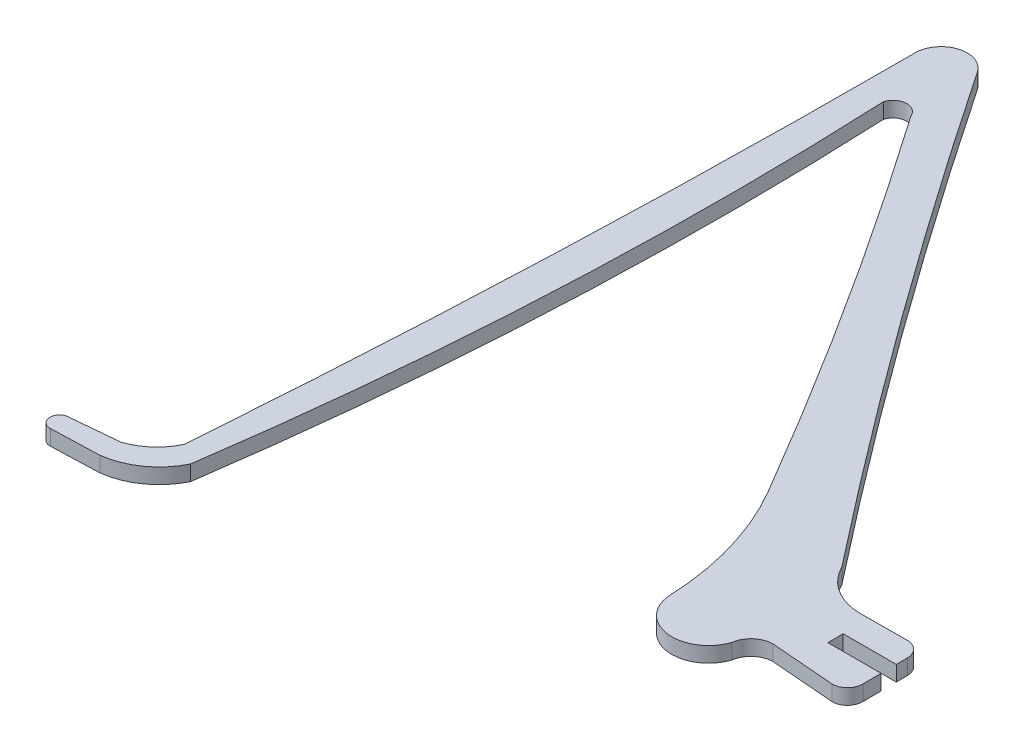
ISO-10303-21;
HEADER;
FILE_DESCRIPTION(('STEP AP214'),'2;1');
FILE_NAME('part.step','',(''),(''),'','','');
FILE_SCHEMA(('AUTOMOTIVE_DESIGN { 1 0 10303 214 1 1 1 1 }'));
ENDSEC;
DATA;
#1=APPLICATION_CONTEXT('core data for automotive mechanical design processes');
#2=APPLICATION_PROTOCOL_DEFINITION('international standard','automotive_design',2000,#1);
#3=PRODUCT_CONTEXT('',#1,'mechanical');
#4=PRODUCT('Part','Part','',(#3));
#5=PRODUCT_RELATED_PRODUCT_CATEGORY('part','',(#4));
#6=PRODUCT_DEFINITION_FORMATION('','',#4);
#7=PRODUCT_DEFINITION_CONTEXT('part definition',#1,'design');
#8=PRODUCT_DEFINITION('design','',#6,#7);
#9=PRODUCT_DEFINITION_SHAPE('','',#8);
#10=(LENGTH_UNIT() NAMED_UNIT(*) SI_UNIT(.MILLI.,.METRE.));
#11=(NAMED_UNIT(*) PLANE_ANGLE_UNIT() SI_UNIT($,.RADIAN.));
#12=(NAMED_UNIT(*) SI_UNIT($,.STERADIAN.) SOLID_ANGLE_UNIT());
#13=UNCERTAINTY_MEASURE_WITH_UNIT(LENGTH_MEASURE(1.E-05),#10,'distance_accuracy_value','');
#14=(GEOMETRIC_REPRESENTATION_CONTEXT(3) GLOBAL_UNCERTAINTY_ASSIGNED_CONTEXT((#13)) GLOBAL_UNIT_ASSIGNED_CONTEXT((#10,
#11,#12)) REPRESENTATION_CONTEXT('',''));
#15=CARTESIAN_POINT('',(0.,0.,0.));
#16=DIRECTION('',(0.,0.,1.));
#17=DIRECTION('',(1.,0.,0.));
#18=AXIS2_PLACEMENT_3D('',#15,#16,#17);
#19=CARTESIAN_POINT('',(-42136.1629241333,3.,-18247.0116923193));
#20=DIRECTION('',(0.,-1.,0.));
#21=DIRECTION('',(0.,0.,-1.));
#22=AXIS2_PLACEMENT_3D('',#19,#20,#21);
#23=CYLINDRICAL_SURFACE('',#22,13.2933695190007);
#24=CARTESIAN_POINT('',(-42136.1629241333,0.,-18247.0116923193));
#25=DIRECTION('',(0.,1.,0.));
#26=DIRECTION('',(0.,0.,1.));
#27=AXIS2_PLACEMENT_3D('',#24,#25,#26);
#28=CIRCLE('',#27,13.2933695190007);
#29=CARTESIAN_POINT('',(-42134.535156,0.,-18233.818359));
#30=VERTEX_POINT('',#29);
#31=CARTESIAN_POINT('',(-42124.20457,0.,-18241.205537));
#32=VERTEX_POINT('',#31);
#33=EDGE_CURVE('E227',#30,#32,#28,.T.);
#34=ORIENTED_EDGE('',*,*,#33,.T.);
#35=DIRECTION('',(0.,-1.,0.));
#36=VECTOR('',#35,1.);
#37=CARTESIAN_POINT('',(-42124.20457,3.,-18241.205537));
#38=LINE('',#37,#36);
#39=CARTESIAN_POINT('',(-42124.20457,3.,-18241.205537));
#40=VERTEX_POINT('',#39);
#41=EDGE_CURVE('E11',#40,#32,#38,.T.);
#42=ORIENTED_EDGE('',*,*,#41,.F.);
#43=CARTESIAN_POINT('',(-42136.1629241333,3.,-18247.0116923193));
#44=DIRECTION('',(0.,1.,0.));
#45=DIRECTION('',(0.,0.,1.));
#46=AXIS2_PLACEMENT_3D('',#43,#44,#45);
#47=CIRCLE('',#46,13.2933695190007);
#48=CARTESIAN_POINT('',(-42134.535156,3.,-18233.818359));
#49=VERTEX_POINT('',#48);
#50=EDGE_CURVE('E273',#49,#40,#47,.T.);
#51=ORIENTED_EDGE('',*,*,#50,.F.);
#52=DIRECTION('',(0.,-1.,0.));
#53=VECTOR('',#52,1.);
#54=CARTESIAN_POINT('',(-42134.535156,3.,-18233.818359));
#55=LINE('',#54,#53);
#56=EDGE_CURVE('E223',#49,#30,#55,.T.);
#57=ORIENTED_EDGE('',*,*,#56,.T.);
#58=EDGE_LOOP('',(#34,#42,#51,#57));
#59=FACE_BOUND('',#58,.T.);
#60=ADVANCED_FACE('F35',(#59),#23,.T.);
#61=CARTESIAN_POINT('',(-42799.5026352517,3.,-18339.4436125575));
#62=DIRECTION('',(0.,-1.,0.));
#63=DIRECTION('',(0.,0.,-1.));
#64=AXIS2_PLACEMENT_3D('',#61,#62,#63);
#65=CYLINDRICAL_SURFACE('',#64,682.406181406615);
#66=CARTESIAN_POINT('',(-42799.5026352517,0.,-18339.4436125575));
#67=DIRECTION('',(0.,1.,0.));
#68=DIRECTION('',(0.,0.,1.));
#69=AXIS2_PLACEMENT_3D('',#66,#67,#68);
#70=CIRCLE('',#69,682.406181406615);
#71=CARTESIAN_POINT('',(-42117.800619,0.,-18370.436474));
#72=VERTEX_POINT('',#71);
#73=EDGE_CURVE('E230',#32,#72,#70,.T.);
#74=ORIENTED_EDGE('',*,*,#73,.T.);
#75=DIRECTION('',(0.,-1.,0.));
#76=VECTOR('',#75,1.);
#77=CARTESIAN_POINT('',(-42117.800619,3.,-18370.436474));
#78=LINE('',#77,#76);
#79=CARTESIAN_POINT('',(-42117.800619,3.,-18370.436474));
#80=VERTEX_POINT('',#79);
#81=EDGE_CURVE('E43',#80,#72,#78,.T.);
#82=ORIENTED_EDGE('',*,*,#81,.F.);
#83=CARTESIAN_POINT('',(-42799.5026352517,3.,-18339.4436125575));
#84=DIRECTION('',(0.,1.,0.));
#85=DIRECTION('',(0.,0.,1.));
#86=AXIS2_PLACEMENT_3D('',#83,#84,#85);
#87=CIRCLE('',#86,682.406181406615);
#88=EDGE_CURVE('E142',#40,#80,#87,.T.);
#89=ORIENTED_EDGE('',*,*,#88,.F.);
#90=ORIENTED_EDGE('',*,*,#41,.T.);
#91=EDGE_LOOP('',(#74,#82,#89,#90));
#92=FACE_BOUND('',#91,.T.);
#93=ADVANCED_FACE('F411',(#92),#65,.T.);
#94=CARTESIAN_POINT('',(-42115.2010584429,3.,-18369.7403817941));
#95=DIRECTION('',(0.,-1.,0.));
#96=DIRECTION('',(0.,0.,-1.));
#97=AXIS2_PLACEMENT_3D('',#94,#95,#96);
#98=CYLINDRICAL_SURFACE('',#97,2.69114463549418);
#99=CARTESIAN_POINT('',(-42115.2010584429,0.,-18369.7403817941));
#100=DIRECTION('',(0.,-1.,0.));
#101=DIRECTION('',(0.,0.,1.));
#102=AXIS2_PLACEMENT_3D('',#99,#100,#101);
#103=CIRCLE('',#102,2.69114463549418);
#104=CARTESIAN_POINT('',(-42112.7270129999,0.,-18370.7993239998));
#105=VERTEX_POINT('',#104);
#106=EDGE_CURVE('E232',#72,#105,#103,.T.);
#107=ORIENTED_EDGE('',*,*,#106,.T.);
#108=DIRECTION('',(0.,-1.,0.));
#109=VECTOR('',#108,1.);
#110=CARTESIAN_POINT('',(-42112.7270129999,3.,-18370.7993239998));
#111=LINE('',#110,#109);
#112=CARTESIAN_POINT('',(-42112.7270129999,3.,-18370.7993239998));
#113=VERTEX_POINT('',#112);
#114=EDGE_CURVE('E328',#113,#105,#111,.T.);
#115=ORIENTED_EDGE('',*,*,#114,.F.);
#116=CARTESIAN_POINT('',(-42115.2010584429,3.,-18369.7403817941));
#117=DIRECTION('',(0.,-1.,0.));
#118=DIRECTION('',(0.,0.,1.));
#119=AXIS2_PLACEMENT_3D('',#116,#117,#118);
#120=CIRCLE('',#119,2.69114463549418);
#121=EDGE_CURVE('E336',#80,#113,#120,.T.);
#122=ORIENTED_EDGE('',*,*,#121,.F.);
#123=ORIENTED_EDGE('',*,*,#81,.T.);
#124=EDGE_LOOP('',(#107,#115,#122,#123));
#125=FACE_BOUND('',#124,.T.);
#126=ADVANCED_FACE('F334',(#125),#98,.F.);
#127=CARTESIAN_POINT('',(-43045.39922722,3.,-17718.987308998));
#128=DIRECTION('',(0.,-1.,0.));
#129=DIRECTION('',(0.,0.,-1.));
#130=AXIS2_PLACEMENT_3D('',#127,#128,#129);
#131=CYLINDRICAL_SURFACE('',#130,1137.8648259257);
#132=CARTESIAN_POINT('',(-43045.39922722,0.,-17718.987308998));
#133=DIRECTION('',(0.,-1.,0.));
#134=DIRECTION('',(0.,0.,1.));
#135=AXIS2_PLACEMENT_3D('',#132,#133,#134);
#136=CIRCLE('',#135,1137.8648259257);
#137=CARTESIAN_POINT('',(-42062.969694,0.,-18293.0679429999));
#138=VERTEX_POINT('',#137);
#139=EDGE_CURVE('E234',#105,#138,#136,.T.);
#140=ORIENTED_EDGE('',*,*,#139,.T.);
#141=DIRECTION('',(0.,-1.,0.));
#142=VECTOR('',#141,1.);
#143=CARTESIAN_POINT('',(-42062.969694,3.,-18293.0679429999));
#144=LINE('',#143,#142);
#145=CARTESIAN_POINT('',(-42062.969694,3.,-18293.0679429999));
#146=VERTEX_POINT('',#145);
#147=EDGE_CURVE('E325',#146,#138,#144,.T.);
#148=ORIENTED_EDGE('',*,*,#147,.F.);
#149=CARTESIAN_POINT('',(-43045.39922722,3.,-17718.987308998));
#150=DIRECTION('',(0.,-1.,0.));
#151=DIRECTION('',(0.,0.,1.));
#152=AXIS2_PLACEMENT_3D('',#149,#150,#151);
#153=CIRCLE('',#152,1137.8648259257);
#154=EDGE_CURVE('E354',#113,#146,#153,.T.);
#155=ORIENTED_EDGE('',*,*,#154,.F.);
#156=ORIENTED_EDGE('',*,*,#114,.T.);
#157=EDGE_LOOP('',(#140,#148,#155,#156));
#158=FACE_BOUND('',#157,.T.);
#159=ADVANCED_FACE('F345',(#158),#131,.F.);
#160=CARTESIAN_POINT('',(-42113.6161511297,3.,-18263.4671733833));
#161=DIRECTION('',(0.,-1.,0.));
#162=DIRECTION('',(0.,0.,-1.));
#163=AXIS2_PLACEMENT_3D('',#160,#161,#162);
#164=CYLINDRICAL_SURFACE('',#163,58.6623318806952);
#165=CARTESIAN_POINT('',(-42113.6161511297,0.,-18263.4671733833));
#166=DIRECTION('',(0.,-1.,0.));
#167=DIRECTION('',(0.,0.,1.));
#168=AXIS2_PLACEMENT_3D('',#165,#166,#167);
#169=CIRCLE('',#168,58.6623318806952);
#170=CARTESIAN_POINT('',(-42055.005587,0.,-18265.931104));
#171=VERTEX_POINT('',#170);
#172=EDGE_CURVE('E236',#138,#171,#169,.T.);
#173=ORIENTED_EDGE('',*,*,#172,.T.);
#174=DIRECTION('',(0.,-1.,0.));
#175=VECTOR('',#174,1.);
#176=CARTESIAN_POINT('',(-42055.005587,3.,-18265.931104));
#177=LINE('',#176,#175);
#178=CARTESIAN_POINT('',(-42055.005587,3.,-18265.931104));
#179=VERTEX_POINT('',#178);
#180=EDGE_CURVE('E322',#179,#171,#177,.T.);
#181=ORIENTED_EDGE('',*,*,#180,.F.);
#182=CARTESIAN_POINT('',(-42113.6161511297,3.,-18263.4671733833));
#183=DIRECTION('',(0.,-1.,0.));
#184=DIRECTION('',(0.,0.,1.));
#185=AXIS2_PLACEMENT_3D('',#182,#183,#184);
#186=CIRCLE('',#185,58.6623318806952);
#187=EDGE_CURVE('E351',#146,#179,#186,.T.);
#188=ORIENTED_EDGE('',*,*,#187,.F.);
#189=ORIENTED_EDGE('',*,*,#147,.T.);
#190=EDGE_LOOP('',(#173,#181,#188,#189));
#191=FACE_BOUND('',#190,.T.);
#192=ADVANCED_FACE('F349',(#191),#164,.F.);
#193=CARTESIAN_POINT('',(-42047.7937259743,3.,-18266.2344820008));
#194=DIRECTION('',(0.,-1.,0.));
#195=DIRECTION('',(0.,0.,-1.));
#196=AXIS2_PLACEMENT_3D('',#193,#194,#195);
#197=CYLINDRICAL_SURFACE('',#196,7.21823923581322);
#198=CARTESIAN_POINT('',(-42047.7937259743,0.,-18266.2344820008));
#199=DIRECTION('',(0.,1.,0.));
#200=DIRECTION('',(0.,0.,1.));
#201=AXIS2_PLACEMENT_3D('',#198,#199,#200);
#202=CIRCLE('',#201,7.21823923581322);
#203=CARTESIAN_POINT('',(-42040.948503,0.,-18263.944089));
#204=VERTEX_POINT('',#203);
#205=EDGE_CURVE('E238',#171,#204,#202,.T.);
#206=ORIENTED_EDGE('',*,*,#205,.T.);
#207=DIRECTION('',(0.,-1.,0.));
#208=VECTOR('',#207,1.);
#209=CARTESIAN_POINT('',(-42040.948503,3.,-18263.944089));
#210=LINE('',#209,#208);
#211=CARTESIAN_POINT('',(-42040.948503,3.,-18263.944089));
#212=VERTEX_POINT('',#211);
#213=EDGE_CURVE('E319',#212,#204,#210,.T.);
#214=ORIENTED_EDGE('',*,*,#213,.F.);
#215=CARTESIAN_POINT('',(-42047.7937259743,3.,-18266.2344820008));
#216=DIRECTION('',(0.,1.,0.));
#217=DIRECTION('',(0.,0.,1.));
#218=AXIS2_PLACEMENT_3D('',#215,#216,#217);
#219=CIRCLE('',#218,7.21823923581322);
#220=EDGE_CURVE('E353',#179,#212,#219,.T.);
#221=ORIENTED_EDGE('',*,*,#220,.F.);
#222=ORIENTED_EDGE('',*,*,#180,.T.);
#223=EDGE_LOOP('',(#206,#214,#221,#222));
#224=FACE_BOUND('',#223,.T.);
#225=ADVANCED_FACE('F424',(#224),#197,.T.);
#226=CARTESIAN_POINT('',(-42036.6327541432,3.,-18263.357472388));
#227=DIRECTION('',(0.,-1.,0.));
#228=DIRECTION('',(0.,0.,-1.));
#229=AXIS2_PLACEMENT_3D('',#226,#227,#228);
#230=CYLINDRICAL_SURFACE('',#229,4.35543421999841);
#231=CARTESIAN_POINT('',(-42036.6327541432,0.,-18263.357472388));
#232=DIRECTION('',(0.,-1.,0.));
#233=DIRECTION('',(0.,0.,1.));
#234=AXIS2_PLACEMENT_3D('',#231,#232,#233);
#235=CIRCLE('',#234,4.35543421999841);
#236=CARTESIAN_POINT('',(-42036.621094,0.,-18267.712891));
#237=VERTEX_POINT('',#236);
#238=EDGE_CURVE('E240',#204,#237,#235,.T.);
#239=ORIENTED_EDGE('',*,*,#238,.T.);
#240=DIRECTION('',(0.,-1.,0.));
#241=VECTOR('',#240,1.);
#242=CARTESIAN_POINT('',(-42036.621094,3.,-18267.712891));
#243=LINE('',#242,#241);
#244=CARTESIAN_POINT('',(-42036.621094,3.,-18267.712891));
#245=VERTEX_POINT('',#244);
#246=EDGE_CURVE('E316',#245,#237,#243,.T.);
#247=ORIENTED_EDGE('',*,*,#246,.F.);
#248=CARTESIAN_POINT('',(-42036.6327541432,3.,-18263.357472388));
#249=DIRECTION('',(0.,-1.,0.));
#250=DIRECTION('',(0.,0.,1.));
#251=AXIS2_PLACEMENT_3D('',#248,#249,#250);
#252=CIRCLE('',#251,4.35543421999841);
#253=EDGE_CURVE('E356',#212,#245,#252,.T.);
#254=ORIENTED_EDGE('',*,*,#253,.F.);
#255=ORIENTED_EDGE('',*,*,#213,.T.);
#256=EDGE_LOOP('',(#239,#247,#254,#255));
#257=FACE_BOUND('',#256,.T.);
#258=ADVANCED_FACE('F427',(#257),#230,.F.);
#259=CARTESIAN_POINT('',(-42024.054306,3.,-18266.695379));
#260=DIRECTION('',(0.0807042317375299,0.,-0.996738093472731));
#261=DIRECTION('',(-0.996738093472731,0.,-0.08070423173753));
#262=AXIS2_PLACEMENT_3D('',#259,#260,#261);
#263=PLANE('',#262);
#264=DIRECTION('',(0.996738093472731,0.,0.0807042317375299));
#265=VECTOR('',#264,1.);
#266=CARTESIAN_POINT('',(-42024.054306,0.,-18266.695379));
#267=LINE('',#266,#265);
#268=CARTESIAN_POINT('',(-42024.054306,0.,-18266.695379));
#269=VERTEX_POINT('',#268);
#270=EDGE_CURVE('E242',#237,#269,#267,.T.);
#271=ORIENTED_EDGE('',*,*,#270,.T.);
#272=DIRECTION('',(0.,-1.,0.));
#273=VECTOR('',#272,1.);
#274=CARTESIAN_POINT('',(-42024.054306,3.,-18266.695379));
#275=LINE('',#274,#273);
#276=CARTESIAN_POINT('',(-42024.054306,3.,-18266.695379));
#277=VERTEX_POINT('',#276);
#278=EDGE_CURVE('E313',#277,#269,#275,.T.);
#279=ORIENTED_EDGE('',*,*,#278,.F.);
#280=DIRECTION('',(0.996738093472731,0.,0.0807042317375299));
#281=VECTOR('',#280,1.);
#282=CARTESIAN_POINT('',(-42024.054306,3.,-18266.695379));
#283=LINE('',#282,#281);
#284=EDGE_CURVE('E362',#245,#277,#283,.T.);
#285=ORIENTED_EDGE('',*,*,#284,.F.);
#286=ORIENTED_EDGE('',*,*,#246,.T.);
#287=EDGE_LOOP('',(#271,#279,#285,#286));
#288=FACE_BOUND('',#287,.T.);
#289=ADVANCED_FACE('F431',(#288),#263,.F.);
#290=CARTESIAN_POINT('',(-42024.0761180298,3.,-18269.6933841043));
#291=DIRECTION('',(0.,-1.,0.));
#292=DIRECTION('',(0.,0.,-1.));
#293=AXIS2_PLACEMENT_3D('',#290,#291,#292);
#294=CYLINDRICAL_SURFACE('',#293,2.99808445010241);
#295=CARTESIAN_POINT('',(-42024.0761180298,0.,-18269.6933841043));
#296=DIRECTION('',(0.,1.,0.));
#297=DIRECTION('',(0.,0.,1.));
#298=AXIS2_PLACEMENT_3D('',#295,#296,#297);
#299=CIRCLE('',#298,2.99808445010241);
#300=CARTESIAN_POINT('',(-42021.0781250001,0.,-18269.716797));
#301=VERTEX_POINT('',#300);
#302=EDGE_CURVE('E244',#269,#301,#299,.T.);
#303=ORIENTED_EDGE('',*,*,#302,.T.);
#304=DIRECTION('',(0.,-1.,0.));
#305=VECTOR('',#304,1.);
#306=CARTESIAN_POINT('',(-42021.0781250001,3.,-18269.716797));
#307=LINE('',#306,#305);
#308=CARTESIAN_POINT('',(-42021.0781250001,3.,-18269.716797));
#309=VERTEX_POINT('',#308);
#310=EDGE_CURVE('E310',#309,#301,#307,.T.);
#311=ORIENTED_EDGE('',*,*,#310,.F.);
#312=CARTESIAN_POINT('',(-42024.0761180298,3.,-18269.6933841043));
#313=DIRECTION('',(0.,1.,0.));
#314=DIRECTION('',(0.,0.,1.));
#315=AXIS2_PLACEMENT_3D('',#312,#313,#314);
#316=CIRCLE('',#315,2.99808445010241);
#317=EDGE_CURVE('E364',#277,#309,#316,.T.);
#318=ORIENTED_EDGE('',*,*,#317,.F.);
#319=ORIENTED_EDGE('',*,*,#278,.T.);
#320=EDGE_LOOP('',(#303,#311,#318,#319));
#321=FACE_BOUND('',#320,.T.);
#322=ADVANCED_FACE('F435',(#321),#294,.T.);
#323=CARTESIAN_POINT('',(-42021.101562,3.,-18273.310547));
#324=DIRECTION('',(-0.999978735045173,0.,0.00652146129754459));
#325=DIRECTION('',(0.0065214612975446,0.,0.999978735045173));
#326=AXIS2_PLACEMENT_3D('',#323,#324,#325);
#327=PLANE('',#326);
#328=DIRECTION('',(-0.0065214612975446,0.,-0.999978735045173));
#329=VECTOR('',#328,1.);
#330=CARTESIAN_POINT('',(-42021.101562,0.,-18273.310547));
#331=LINE('',#330,#329);
#332=CARTESIAN_POINT('',(-42021.101562,0.,-18273.310547));
#333=VERTEX_POINT('',#332);
#334=EDGE_CURVE('E246',#301,#333,#331,.T.);
#335=ORIENTED_EDGE('',*,*,#334,.T.);
#336=DIRECTION('',(0.,-1.,0.));
#337=VECTOR('',#336,1.);
#338=CARTESIAN_POINT('',(-42021.101562,3.,-18273.310547));
#339=LINE('',#338,#337);
#340=CARTESIAN_POINT('',(-42021.101562,3.,-18273.310547));
#341=VERTEX_POINT('',#340);
#342=EDGE_CURVE('E307',#341,#333,#339,.T.);
#343=ORIENTED_EDGE('',*,*,#342,.F.);
#344=DIRECTION('',(-0.0065214612975446,0.,-0.999978735045173));
#345=VECTOR('',#344,1.);
#346=CARTESIAN_POINT('',(-42021.101562,3.,-18273.310547));
#347=LINE('',#346,#345);
#348=EDGE_CURVE('E366',#309,#341,#347,.T.);
#349=ORIENTED_EDGE('',*,*,#348,.F.);
#350=ORIENTED_EDGE('',*,*,#310,.T.);
#351=EDGE_LOOP('',(#335,#343,#349,#350));
#352=FACE_BOUND('',#351,.T.);
#353=ADVANCED_FACE('F439',(#352),#327,.F.);
#354=CARTESIAN_POINT('',(-42031.503906,3.,-18273.308594));
#355=DIRECTION('',(0.000187746143302033,0.,0.999999982375693));
#356=DIRECTION('',(0.999999982375693,0.,-0.000187746143302033));
#357=AXIS2_PLACEMENT_3D('',#354,#355,#356);
#358=PLANE('',#357);
#359=DIRECTION('',(-0.999999982375693,0.,0.000187746143302033));
#360=VECTOR('',#359,1.);
#361=CARTESIAN_POINT('',(-42031.503906,0.,-18273.308594));
#362=LINE('',#361,#360);
#363=CARTESIAN_POINT('',(-42031.503906,0.,-18273.308594));
#364=VERTEX_POINT('',#363);
#365=EDGE_CURVE('E248',#333,#364,#362,.T.);
#366=ORIENTED_EDGE('',*,*,#365,.T.);
#367=DIRECTION('',(0.,-1.,0.));
#368=VECTOR('',#367,1.);
#369=CARTESIAN_POINT('',(-42031.503906,3.,-18273.308594));
#370=LINE('',#369,#368);
#371=CARTESIAN_POINT('',(-42031.503906,3.,-18273.308594));
#372=VERTEX_POINT('',#371);
#373=EDGE_CURVE('E304',#372,#364,#370,.T.);
#374=ORIENTED_EDGE('',*,*,#373,.F.);
#375=DIRECTION('',(-0.999999982375693,0.,0.000187746143302033));
#376=VECTOR('',#375,1.);
#377=CARTESIAN_POINT('',(-42031.503906,3.,-18273.308594));
#378=LINE('',#377,#376);
#379=EDGE_CURVE('E368',#341,#372,#378,.T.);
#380=ORIENTED_EDGE('',*,*,#379,.F.);
#381=ORIENTED_EDGE('',*,*,#342,.T.);
#382=EDGE_LOOP('',(#366,#374,#380,#381));
#383=FACE_BOUND('',#382,.T.);
#384=ADVANCED_FACE('F443',(#383),#358,.F.);
#385=CARTESIAN_POINT('',(-42031.527344,3.,-18276.308594));
#386=DIRECTION('',(-0.999969482516793,0.,0.00781242824594002));
#387=DIRECTION('',(0.00781242824594003,0.,0.999969482516793));
#388=AXIS2_PLACEMENT_3D('',#385,#386,#387);
#389=PLANE('',#388);
#390=DIRECTION('',(-0.00781242824594002,0.,-0.999969482516792));
#391=VECTOR('',#390,1.);
#392=CARTESIAN_POINT('',(-42031.527344,0.,-18276.308594));
#393=LINE('',#392,#391);
#394=CARTESIAN_POINT('',(-42031.527344,0.,-18276.308594));
#395=VERTEX_POINT('',#394);
#396=EDGE_CURVE('E250',#364,#395,#393,.T.);
#397=ORIENTED_EDGE('',*,*,#396,.T.);
#398=DIRECTION('',(0.,-1.,0.));
#399=VECTOR('',#398,1.);
#400=CARTESIAN_POINT('',(-42031.527344,3.,-18276.308594));
#401=LINE('',#400,#399);
#402=CARTESIAN_POINT('',(-42031.527344,3.,-18276.308594));
#403=VERTEX_POINT('',#402);
#404=EDGE_CURVE('E301',#403,#395,#401,.T.);
#405=ORIENTED_EDGE('',*,*,#404,.F.);
#406=DIRECTION('',(-0.00781242824594002,0.,-0.999969482516792));
#407=VECTOR('',#406,1.);
#408=CARTESIAN_POINT('',(-42031.527344,3.,-18276.308594));
#409=LINE('',#408,#407);
#410=EDGE_CURVE('E370',#372,#403,#409,.T.);
#411=ORIENTED_EDGE('',*,*,#410,.F.);
#412=ORIENTED_EDGE('',*,*,#373,.T.);
#413=EDGE_LOOP('',(#397,#405,#411,#412));
#414=FACE_BOUND('',#413,.T.);
#415=ADVANCED_FACE('F447',(#414),#389,.F.);
#416=CARTESIAN_POINT('',(-42021.117187,3.,-18276.308594));
#417=DIRECTION('',(0.,0.,-1.));
#418=DIRECTION('',(-1.,0.,0.));
#419=AXIS2_PLACEMENT_3D('',#416,#417,#418);
#420=PLANE('',#419);
#421=DIRECTION('',(1.,0.,0.));
#422=VECTOR('',#421,1.);
#423=CARTESIAN_POINT('',(-42021.117187,0.,-18276.308594));
#424=LINE('',#423,#422);
#425=CARTESIAN_POINT('',(-42021.117187,0.,-18276.308594));
#426=VERTEX_POINT('',#425);
#427=EDGE_CURVE('E252',#395,#426,#424,.T.);
#428=ORIENTED_EDGE('',*,*,#427,.T.);
#429=DIRECTION('',(0.,-1.,0.));
#430=VECTOR('',#429,1.);
#431=CARTESIAN_POINT('',(-42021.117187,3.,-18276.308594));
#432=LINE('',#431,#430);
#433=CARTESIAN_POINT('',(-42021.117187,3.,-18276.308594));
#434=VERTEX_POINT('',#433);
#435=EDGE_CURVE('E298',#434,#426,#432,.T.);
#436=ORIENTED_EDGE('',*,*,#435,.F.);
#437=DIRECTION('',(1.,0.,0.));
#438=VECTOR('',#437,1.);
#439=CARTESIAN_POINT('',(-42021.117187,3.,-18276.308594));
#440=LINE('',#439,#438);
#441=EDGE_CURVE('E372',#403,#434,#440,.T.);
#442=ORIENTED_EDGE('',*,*,#441,.F.);
#443=ORIENTED_EDGE('',*,*,#404,.T.);
#444=EDGE_LOOP('',(#428,#436,#442,#443));
#445=FACE_BOUND('',#444,.T.);
#446=ADVANCED_FACE('F451',(#445),#420,.F.);
#447=CARTESIAN_POINT('',(-42021.132872,3.,-18278.491515));
#448=DIRECTION('',(-0.999974186541505,0.,0.0071851409627669));
#449=DIRECTION('',(0.0071851409627669,0.,0.999974186541505));
#450=AXIS2_PLACEMENT_3D('',#447,#448,#449);
#451=PLANE('',#450);
#452=DIRECTION('',(-0.0071851409627669,0.,-0.999974186541505));
#453=VECTOR('',#452,1.);
#454=CARTESIAN_POINT('',(-42021.132872,0.,-18278.491515));
#455=LINE('',#454,#453);
#456=CARTESIAN_POINT('',(-42021.132872,0.,-18278.491515));
#457=VERTEX_POINT('',#456);
#458=EDGE_CURVE('E254',#426,#457,#455,.T.);
#459=ORIENTED_EDGE('',*,*,#458,.T.);
#460=DIRECTION('',(0.,-1.,0.));
#461=VECTOR('',#460,1.);
#462=CARTESIAN_POINT('',(-42021.132872,3.,-18278.491515));
#463=LINE('',#462,#461);
#464=CARTESIAN_POINT('',(-42021.132872,3.,-18278.491515));
#465=VERTEX_POINT('',#464);
#466=EDGE_CURVE('E295',#465,#457,#463,.T.);
#467=ORIENTED_EDGE('',*,*,#466,.F.);
#468=DIRECTION('',(-0.0071851409627669,0.,-0.999974186541505));
#469=VECTOR('',#468,1.);
#470=CARTESIAN_POINT('',(-42021.132872,3.,-18278.491515));
#471=LINE('',#470,#469);
#472=EDGE_CURVE('E374',#434,#465,#471,.T.);
#473=ORIENTED_EDGE('',*,*,#472,.F.);
#474=ORIENTED_EDGE('',*,*,#435,.T.);
#475=EDGE_LOOP('',(#459,#467,#473,#474));
#476=FACE_BOUND('',#475,.T.);
#477=ADVANCED_FACE('F455',(#476),#451,.F.);
#478=CARTESIAN_POINT('',(-42024.1348082438,3.,-18278.4746294841));
#479=DIRECTION('',(0.,-1.,0.));
#480=DIRECTION('',(0.,0.,-1.));
#481=AXIS2_PLACEMENT_3D('',#478,#479,#480);
#482=CYLINDRICAL_SURFACE('',#481,3.00198373291659);
#483=CARTESIAN_POINT('',(-42024.1348082438,0.,-18278.4746294841));
#484=DIRECTION('',(0.,1.,0.));
#485=DIRECTION('',(0.,0.,1.));
#486=AXIS2_PLACEMENT_3D('',#483,#484,#485);
#487=CIRCLE('',#486,3.00198373291659);
#488=CARTESIAN_POINT('',(-42024.152344,0.,-18281.476562));
#489=VERTEX_POINT('',#488);
#490=EDGE_CURVE('E256',#457,#489,#487,.T.);
#491=ORIENTED_EDGE('',*,*,#490,.T.);
#492=DIRECTION('',(0.,-1.,0.));
#493=VECTOR('',#492,1.);
#494=CARTESIAN_POINT('',(-42024.152344,3.,-18281.476562));
#495=LINE('',#494,#493);
#496=CARTESIAN_POINT('',(-42024.152344,3.,-18281.476562));
#497=VERTEX_POINT('',#496);
#498=EDGE_CURVE('E292',#497,#489,#495,.T.);
#499=ORIENTED_EDGE('',*,*,#498,.F.);
#500=CARTESIAN_POINT('',(-42024.1348082438,3.,-18278.4746294841));
#501=DIRECTION('',(0.,1.,0.));
#502=DIRECTION('',(0.,0.,1.));
#503=AXIS2_PLACEMENT_3D('',#500,#501,#502);
#504=CIRCLE('',#503,3.00198373291659);
#505=EDGE_CURVE('E376',#465,#497,#504,.T.);
#506=ORIENTED_EDGE('',*,*,#505,.F.);
#507=ORIENTED_EDGE('',*,*,#466,.T.);
#508=EDGE_LOOP('',(#491,#499,#506,#507));
#509=FACE_BOUND('',#508,.T.);
#510=ADVANCED_FACE('F459',(#509),#482,.T.);
#511=CARTESIAN_POINT('',(-42033.452371,3.,-18281.420521));
#512=DIRECTION('',(0.00602578708217237,0.,0.999981844780214));
#513=DIRECTION('',(0.999981844780214,0.,-0.00602578708217237));
#514=AXIS2_PLACEMENT_3D('',#511,#512,#513);
#515=PLANE('',#514);
#516=DIRECTION('',(-0.999981844780214,0.,0.00602578708217237));
#517=VECTOR('',#516,1.);
#518=CARTESIAN_POINT('',(-42033.452371,0.,-18281.420521));
#519=LINE('',#518,#517);
#520=CARTESIAN_POINT('',(-42033.452371,0.,-18281.420521));
#521=VERTEX_POINT('',#520);
#522=EDGE_CURVE('E258',#489,#521,#519,.T.);
#523=ORIENTED_EDGE('',*,*,#522,.T.);
#524=DIRECTION('',(0.,-1.,0.));
#525=VECTOR('',#524,1.);
#526=CARTESIAN_POINT('',(-42033.452371,3.,-18281.420521));
#527=LINE('',#526,#525);
#528=CARTESIAN_POINT('',(-42033.452371,3.,-18281.420521));
#529=VERTEX_POINT('',#528);
#530=EDGE_CURVE('E289',#529,#521,#527,.T.);
#531=ORIENTED_EDGE('',*,*,#530,.F.);
#532=DIRECTION('',(-0.999981844780214,0.,0.00602578708217237));
#533=VECTOR('',#532,1.);
#534=CARTESIAN_POINT('',(-42033.452371,3.,-18281.420521));
#535=LINE('',#534,#533);
#536=EDGE_CURVE('E378',#497,#529,#535,.T.);
#537=ORIENTED_EDGE('',*,*,#536,.F.);
#538=ORIENTED_EDGE('',*,*,#498,.T.);
#539=EDGE_LOOP('',(#523,#531,#537,#538));
#540=FACE_BOUND('',#539,.T.);
#541=ADVANCED_FACE('F463',(#540),#515,.F.);
#542=CARTESIAN_POINT('',(-42033.2245608101,3.,-18292.2746570495));
#543=DIRECTION('',(0.,-1.,0.));
#544=DIRECTION('',(0.,0.,-1.));
#545=AXIS2_PLACEMENT_3D('',#542,#543,#544);
#546=CYLINDRICAL_SURFACE('',#545,10.856526463997);
#547=CARTESIAN_POINT('',(-42033.2245608101,0.,-18292.2746570495));
#548=DIRECTION('',(0.,-1.,0.));
#549=DIRECTION('',(0.,0.,1.));
#550=AXIS2_PLACEMENT_3D('',#547,#548,#549);
#551=CIRCLE('',#550,10.856526463997);
#552=CARTESIAN_POINT('',(-42042.9887739998,0.,-18287.5286789997));
#553=VERTEX_POINT('',#552);
#554=EDGE_CURVE('E260',#521,#553,#551,.T.);
#555=ORIENTED_EDGE('',*,*,#554,.T.);
#556=DIRECTION('',(0.,-1.,0.));
#557=VECTOR('',#556,1.);
#558=CARTESIAN_POINT('',(-42042.9887739998,3.,-18287.5286789997));
#559=LINE('',#558,#557);
#560=CARTESIAN_POINT('',(-42042.9887739998,3.,-18287.5286789997));
#561=VERTEX_POINT('',#560);
#562=EDGE_CURVE('E286',#561,#553,#559,.T.);
#563=ORIENTED_EDGE('',*,*,#562,.F.);
#564=CARTESIAN_POINT('',(-42033.2245608101,3.,-18292.2746570495));
#565=DIRECTION('',(0.,-1.,0.));
#566=DIRECTION('',(0.,0.,1.));
#567=AXIS2_PLACEMENT_3D('',#564,#565,#566);
#568=CIRCLE('',#567,10.856526463997);
#569=EDGE_CURVE('E380',#529,#561,#568,.T.);
#570=ORIENTED_EDGE('',*,*,#569,.F.);
#571=ORIENTED_EDGE('',*,*,#530,.T.);
#572=EDGE_LOOP('',(#555,#563,#570,#571));
#573=FACE_BOUND('',#572,.T.);
#574=ADVANCED_FACE('F467',(#573),#546,.F.);
#575=CARTESIAN_POINT('',(-40781.9142322962,3.,-19278.6638095235));
#576=DIRECTION('',(0.,-1.,0.));
#577=DIRECTION('',(0.,0.,-1.));
#578=AXIS2_PLACEMENT_3D('',#575,#576,#577);
#579=CYLINDRICAL_SURFACE('',#578,1603.9506995826);
#580=CARTESIAN_POINT('',(-40781.9142322962,0.,-19278.6638095235));
#581=DIRECTION('',(0.,-1.,0.));
#582=DIRECTION('',(0.,0.,1.));
#583=AXIS2_PLACEMENT_3D('',#580,#581,#582);
#584=CIRCLE('',#583,1603.9506995826);
#585=CARTESIAN_POINT('',(-42113.6243129999,0.,-18384.680528));
#586=VERTEX_POINT('',#585);
#587=EDGE_CURVE('E262',#553,#586,#584,.T.);
#588=ORIENTED_EDGE('',*,*,#587,.T.);
#589=DIRECTION('',(0.,-1.,0.));
#590=VECTOR('',#589,1.);
#591=CARTESIAN_POINT('',(-42113.6243129999,3.,-18384.680528));
#592=LINE('',#591,#590);
#593=CARTESIAN_POINT('',(-42113.6243129999,3.,-18384.680528));
#594=VERTEX_POINT('',#593);
#595=EDGE_CURVE('E283',#594,#586,#592,.T.);
#596=ORIENTED_EDGE('',*,*,#595,.F.);
#597=CARTESIAN_POINT('',(-40781.9142322962,3.,-19278.6638095235));
#598=DIRECTION('',(0.,-1.,0.));
#599=DIRECTION('',(0.,0.,1.));
#600=AXIS2_PLACEMENT_3D('',#597,#598,#599);
#601=CIRCLE('',#600,1603.9506995826);
#602=EDGE_CURVE('E382',#561,#594,#601,.T.);
#603=ORIENTED_EDGE('',*,*,#602,.F.);
#604=ORIENTED_EDGE('',*,*,#562,.T.);
#605=EDGE_LOOP('',(#588,#596,#603,#604));
#606=FACE_BOUND('',#605,.T.);
#607=ADVANCED_FACE('F471',(#606),#579,.F.);
#608=CARTESIAN_POINT('',(-42117.8760857451,3.,-18381.8277422377));
#609=DIRECTION('',(0.,-1.,0.));
#610=DIRECTION('',(0.,0.,-1.));
#611=AXIS2_PLACEMENT_3D('',#608,#609,#610);
#612=CYLINDRICAL_SURFACE('',#611,5.12015215416163);
#613=CARTESIAN_POINT('',(-42117.8760857451,0.,-18381.8277422377));
#614=DIRECTION('',(0.,1.,0.));
#615=DIRECTION('',(0.,0.,1.));
#616=AXIS2_PLACEMENT_3D('',#613,#614,#615);
#617=CIRCLE('',#616,5.12015215416163);
#618=CARTESIAN_POINT('',(-42122.976922,0.,-18381.3834140009));
#619=VERTEX_POINT('',#618);
#620=EDGE_CURVE('E264',#586,#619,#617,.T.);
#621=ORIENTED_EDGE('',*,*,#620,.T.);
#622=DIRECTION('',(0.,-1.,0.));
#623=VECTOR('',#622,1.);
#624=CARTESIAN_POINT('',(-42122.976922,3.,-18381.3834140009));
#625=LINE('',#624,#623);
#626=CARTESIAN_POINT('',(-42122.976922,3.,-18381.3834140009));
#627=VERTEX_POINT('',#626);
#628=EDGE_CURVE('E280',#627,#619,#625,.T.);
#629=ORIENTED_EDGE('',*,*,#628,.F.);
#630=CARTESIAN_POINT('',(-42117.8760857451,3.,-18381.8277422377));
#631=DIRECTION('',(0.,1.,0.));
#632=DIRECTION('',(0.,0.,1.));
#633=AXIS2_PLACEMENT_3D('',#630,#631,#632);
#634=CIRCLE('',#633,5.12015215416163);
#635=EDGE_CURVE('E384',#594,#627,#634,.T.);
#636=ORIENTED_EDGE('',*,*,#635,.F.);
#637=ORIENTED_EDGE('',*,*,#595,.T.);
#638=EDGE_LOOP('',(#621,#629,#636,#637));
#639=FACE_BOUND('',#638,.T.);
#640=ADVANCED_FACE('F475',(#639),#612,.T.);
#641=CARTESIAN_POINT('',(-43893.4192093769,3.,-18379.0783183289));
#642=DIRECTION('',(0.,-1.,0.));
#643=DIRECTION('',(0.,0.,-1.));
#644=AXIS2_PLACEMENT_3D('',#641,#642,#643);
#645=CYLINDRICAL_SURFACE('',#644,1770.4437879804);
#646=CARTESIAN_POINT('',(-43893.4192093769,0.,-18379.0783183289));
#647=DIRECTION('',(0.,-1.,0.));
#648=DIRECTION('',(0.,0.,1.));
#649=AXIS2_PLACEMENT_3D('',#646,#647,#648);
#650=CIRCLE('',#649,1770.4437879804);
#651=CARTESIAN_POINT('',(-42128.142478,0.,-18243.9144620001));
#652=VERTEX_POINT('',#651);
#653=EDGE_CURVE('E266',#619,#652,#650,.T.);
#654=ORIENTED_EDGE('',*,*,#653,.T.);
#655=DIRECTION('',(0.,-1.,0.));
#656=VECTOR('',#655,1.);
#657=CARTESIAN_POINT('',(-42128.142478,3.,-18243.9144620001));
#658=LINE('',#657,#656);
#659=CARTESIAN_POINT('',(-42128.142478,3.,-18243.9144620001));
#660=VERTEX_POINT('',#659);
#661=EDGE_CURVE('E277',#660,#652,#658,.T.);
#662=ORIENTED_EDGE('',*,*,#661,.F.);
#663=CARTESIAN_POINT('',(-43893.4192093769,3.,-18379.0783183289));
#664=DIRECTION('',(0.,-1.,0.));
#665=DIRECTION('',(0.,0.,1.));
#666=AXIS2_PLACEMENT_3D('',#663,#664,#665);
#667=CIRCLE('',#666,1770.4437879804);
#668=EDGE_CURVE('E386',#627,#660,#667,.T.);
#669=ORIENTED_EDGE('',*,*,#668,.F.);
#670=ORIENTED_EDGE('',*,*,#628,.T.);
#671=EDGE_LOOP('',(#654,#662,#669,#670));
#672=FACE_BOUND('',#671,.T.);
#673=ADVANCED_FACE('F392',(#672),#645,.F.);
#674=CARTESIAN_POINT('',(-42138.2852787814,3.,-18248.7210245995));
#675=DIRECTION('',(0.,-1.,0.));
#676=DIRECTION('',(0.,0.,-1.));
#677=AXIS2_PLACEMENT_3D('',#674,#675,#676);
#678=CYLINDRICAL_SURFACE('',#677,11.2240568295967);
#679=CARTESIAN_POINT('',(-42138.2852787814,0.,-18248.7210245995));
#680=DIRECTION('',(0.,-1.,0.));
#681=DIRECTION('',(0.,0.,1.));
#682=AXIS2_PLACEMENT_3D('',#679,#680,#681);
#683=CIRCLE('',#682,11.2240568295967);
#684=CARTESIAN_POINT('',(-42134.691406,0.,-18238.087891));
#685=VERTEX_POINT('',#684);
#686=EDGE_CURVE('E268',#652,#685,#683,.T.);
#687=ORIENTED_EDGE('',*,*,#686,.T.);
#688=DIRECTION('',(0.,-1.,0.));
#689=VECTOR('',#688,1.);
#690=CARTESIAN_POINT('',(-42134.691406,3.,-18238.087891));
#691=LINE('',#690,#689);
#692=CARTESIAN_POINT('',(-42134.691406,3.,-18238.087891));
#693=VERTEX_POINT('',#692);
#694=EDGE_CURVE('E218',#693,#685,#691,.T.);
#695=ORIENTED_EDGE('',*,*,#694,.F.);
#696=CARTESIAN_POINT('',(-42138.2852787814,3.,-18248.7210245995));
#697=DIRECTION('',(0.,-1.,0.));
#698=DIRECTION('',(0.,0.,1.));
#699=AXIS2_PLACEMENT_3D('',#696,#697,#698);
#700=CIRCLE('',#699,11.2240568295967);
#701=EDGE_CURVE('E209',#660,#693,#700,.T.);
#702=ORIENTED_EDGE('',*,*,#701,.F.);
#703=ORIENTED_EDGE('',*,*,#661,.T.);
#704=EDGE_LOOP('',(#687,#695,#702,#703));
#705=FACE_BOUND('',#704,.T.);
#706=ADVANCED_FACE('F396',(#705),#678,.F.);
#707=CARTESIAN_POINT('',(-42143.861136,3.,-18237.243574));
#708=DIRECTION('',(0.0916886866851147,0.,0.995787720718607));
#709=DIRECTION('',(0.995787720718607,0.,-0.0916886866851147));
#710=AXIS2_PLACEMENT_3D('',#707,#708,#709);
#711=PLANE('',#710);
#712=DIRECTION('',(-0.995787720718607,0.,0.0916886866851147));
#713=VECTOR('',#712,1.);
#714=CARTESIAN_POINT('',(-42143.861136,0.,-18237.243574));
#715=LINE('',#714,#713);
#716=CARTESIAN_POINT('',(-42143.861136,0.,-18237.243574));
#717=VERTEX_POINT('',#716);
#718=EDGE_CURVE('E217',#685,#717,#715,.T.);
#719=ORIENTED_EDGE('',*,*,#718,.T.);
#720=DIRECTION('',(0.,-1.,0.));
#721=VECTOR('',#720,1.);
#722=CARTESIAN_POINT('',(-42143.861136,3.,-18237.243574));
#723=LINE('',#722,#721);
#724=CARTESIAN_POINT('',(-42143.861136,3.,-18237.243574));
#725=VERTEX_POINT('',#724);
#726=EDGE_CURVE('E214',#725,#717,#723,.T.);
#727=ORIENTED_EDGE('',*,*,#726,.F.);
#728=DIRECTION('',(-0.995787720718607,0.,0.0916886866851147));
#729=VECTOR('',#728,1.);
#730=CARTESIAN_POINT('',(-42143.861136,3.,-18237.243574));
#731=LINE('',#730,#729);
#732=EDGE_CURVE('E203',#693,#725,#731,.T.);
#733=ORIENTED_EDGE('',*,*,#732,.F.);
#734=ORIENTED_EDGE('',*,*,#694,.T.);
#735=EDGE_LOOP('',(#719,#727,#733,#734));
#736=FACE_BOUND('',#735,.T.);
#737=ADVANCED_FACE('F215',(#736),#711,.F.);
#738=CARTESIAN_POINT('',(-42144.0156853855,3.,-18235.3704752379));
#739=DIRECTION('',(0.,-1.,0.));
#740=DIRECTION('',(0.,0.,-1.));
#741=AXIS2_PLACEMENT_3D('',#738,#739,#740);
#742=CYLINDRICAL_SURFACE('',#741,1.8794638823728);
#743=CARTESIAN_POINT('',(-42144.0156853855,0.,-18235.3704752379));
#744=DIRECTION('',(0.,1.,0.));
#745=DIRECTION('',(0.,0.,1.));
#746=AXIS2_PLACEMENT_3D('',#743,#744,#745);
#747=CIRCLE('',#746,1.8794638823728);
#748=CARTESIAN_POINT('',(-42143.949219,0.,-18233.492187));
#749=VERTEX_POINT('',#748);
#750=EDGE_CURVE('E128',#717,#749,#747,.T.);
#751=ORIENTED_EDGE('',*,*,#750,.T.);
#752=DIRECTION('',(0.,-1.,0.));
#753=VECTOR('',#752,1.);
#754=CARTESIAN_POINT('',(-42143.949219,3.,-18233.492187));
#755=LINE('',#754,#753);
#756=CARTESIAN_POINT('',(-42143.949219,3.,-18233.492187));
#757=VERTEX_POINT('',#756);
#758=EDGE_CURVE('E219',#757,#749,#755,.T.);
#759=ORIENTED_EDGE('',*,*,#758,.F.);
#760=CARTESIAN_POINT('',(-42144.0156853855,3.,-18235.3704752379));
#761=DIRECTION('',(0.,1.,0.));
#762=DIRECTION('',(0.,0.,1.));
#763=AXIS2_PLACEMENT_3D('',#760,#761,#762);
#764=CIRCLE('',#763,1.8794638823728);
#765=EDGE_CURVE('E207',#725,#757,#764,.T.);
#766=ORIENTED_EDGE('',*,*,#765,.F.);
#767=ORIENTED_EDGE('',*,*,#726,.T.);
#768=EDGE_LOOP('',(#751,#759,#766,#767));
#769=FACE_BOUND('',#768,.T.);
#770=ADVANCED_FACE('F221',(#769),#742,.T.);
#771=CARTESIAN_POINT('',(-42134.535156,3.,-18233.818359));
#772=DIRECTION('',(-0.0346265370984575,0.,-0.999400321657227));
#773=DIRECTION('',(-0.999400321657227,0.,0.0346265370984575));
#774=AXIS2_PLACEMENT_3D('',#771,#772,#773);
#775=PLANE('',#774);
#776=DIRECTION('',(0.999400321657227,0.,-0.0346265370984575));
#777=VECTOR('',#776,1.);
#778=CARTESIAN_POINT('',(-42134.535156,0.,-18233.818359));
#779=LINE('',#778,#777);
#780=EDGE_CURVE('E134',#749,#30,#779,.T.);
#781=ORIENTED_EDGE('',*,*,#780,.T.);
#782=ORIENTED_EDGE('',*,*,#56,.F.);
#783=DIRECTION('',(0.999400321657227,0.,-0.0346265370984575));
#784=VECTOR('',#783,1.);
#785=CARTESIAN_POINT('',(-42134.535156,3.,-18233.818359));
#786=LINE('',#785,#784);
#787=EDGE_CURVE('E51',#757,#49,#786,.T.);
#788=ORIENTED_EDGE('',*,*,#787,.F.);
#789=ORIENTED_EDGE('',*,*,#758,.T.);
#790=EDGE_LOOP('',(#781,#782,#788,#789));
#791=FACE_BOUND('',#790,.T.);
#792=ADVANCED_FACE('F400',(#791),#775,.F.);
#793=CARTESIAN_POINT('',(-42136.1629241333,3.,-18247.0116923193));
#794=DIRECTION('',(0.,1.,0.));
#795=DIRECTION('',(0.,0.,1.));
#796=AXIS2_PLACEMENT_3D('',#793,#794,#795);
#797=PLANE('',#796);
#798=ORIENTED_EDGE('',*,*,#50,.T.);
#799=ORIENTED_EDGE('',*,*,#88,.T.);
#800=ORIENTED_EDGE('',*,*,#121,.T.);
#801=ORIENTED_EDGE('',*,*,#154,.T.);
#802=ORIENTED_EDGE('',*,*,#187,.T.);
#803=ORIENTED_EDGE('',*,*,#220,.T.);
#804=ORIENTED_EDGE('',*,*,#253,.T.);
#805=ORIENTED_EDGE('',*,*,#284,.T.);
#806=ORIENTED_EDGE('',*,*,#317,.T.);
#807=ORIENTED_EDGE('',*,*,#348,.T.);
#808=ORIENTED_EDGE('',*,*,#379,.T.);
#809=ORIENTED_EDGE('',*,*,#410,.T.);
#810=ORIENTED_EDGE('',*,*,#441,.T.);
#811=ORIENTED_EDGE('',*,*,#472,.T.);
#812=ORIENTED_EDGE('',*,*,#505,.T.);
#813=ORIENTED_EDGE('',*,*,#536,.T.);
#814=ORIENTED_EDGE('',*,*,#569,.T.);
#815=ORIENTED_EDGE('',*,*,#602,.T.);
#816=ORIENTED_EDGE('',*,*,#635,.T.);
#817=ORIENTED_EDGE('',*,*,#668,.T.);
#818=ORIENTED_EDGE('',*,*,#701,.T.);
#819=ORIENTED_EDGE('',*,*,#732,.T.);
#820=ORIENTED_EDGE('',*,*,#765,.T.);
#821=ORIENTED_EDGE('',*,*,#787,.T.);
#822=EDGE_LOOP('',(#798,#799,#800,#801,#802,#803,#804,#805,#806,#807,#808,#809,#810,#811,#812,
#813,#814,#815,#816,#817,#818,#819,#820,#821));
#823=FACE_BOUND('',#822,.T.);
#824=ADVANCED_FACE('F205',(#823),#797,.T.);
#825=CARTESIAN_POINT('',(-42136.1629241333,0.,-18247.0116923193));
#826=DIRECTION('',(0.,1.,0.));
#827=DIRECTION('',(0.,0.,1.));
#828=AXIS2_PLACEMENT_3D('',#825,#826,#827);
#829=PLANE('',#828);
#830=ORIENTED_EDGE('',*,*,#33,.F.);
#831=ORIENTED_EDGE('',*,*,#780,.F.);
#832=ORIENTED_EDGE('',*,*,#750,.F.);
#833=ORIENTED_EDGE('',*,*,#718,.F.);
#834=ORIENTED_EDGE('',*,*,#686,.F.);
#835=ORIENTED_EDGE('',*,*,#653,.F.);
#836=ORIENTED_EDGE('',*,*,#620,.F.);
#837=ORIENTED_EDGE('',*,*,#587,.F.);
#838=ORIENTED_EDGE('',*,*,#554,.F.);
#839=ORIENTED_EDGE('',*,*,#522,.F.);
#840=ORIENTED_EDGE('',*,*,#490,.F.);
#841=ORIENTED_EDGE('',*,*,#458,.F.);
#842=ORIENTED_EDGE('',*,*,#427,.F.);
#843=ORIENTED_EDGE('',*,*,#396,.F.);
#844=ORIENTED_EDGE('',*,*,#365,.F.);
#845=ORIENTED_EDGE('',*,*,#334,.F.);
#846=ORIENTED_EDGE('',*,*,#302,.F.);
#847=ORIENTED_EDGE('',*,*,#270,.F.);
#848=ORIENTED_EDGE('',*,*,#238,.F.);
#849=ORIENTED_EDGE('',*,*,#205,.F.);
#850=ORIENTED_EDGE('',*,*,#172,.F.);
#851=ORIENTED_EDGE('',*,*,#139,.F.);
#852=ORIENTED_EDGE('',*,*,#106,.F.);
#853=ORIENTED_EDGE('',*,*,#73,.F.);
#854=EDGE_LOOP('',(#830,#831,#832,#833,#834,#835,#836,#837,#838,#839,#840,#841,#842,#843,#844,
#845,#846,#847,#848,#849,#850,#851,#852,#853));
#855=FACE_BOUND('',#854,.T.);
#856=ADVANCED_FACE('F340',(#855),#829,.F.);
#857=CLOSED_SHELL('',(#60,#93,#126,#159,#192,#225,#258,#289,#322,#353,#384,#415,#446,#477,#510,
#541,#574,#607,#640,#673,#706,#737,#770,#792,#824,#856));
#858=MANIFOLD_SOLID_BREP('B2',#857);
#859=ADVANCED_BREP_SHAPE_REPRESENTATION('',(#18,#858),#14);
#860=SHAPE_DEFINITION_REPRESENTATION(#9,#859);
ENDSEC;
END-ISO-10303-21;
